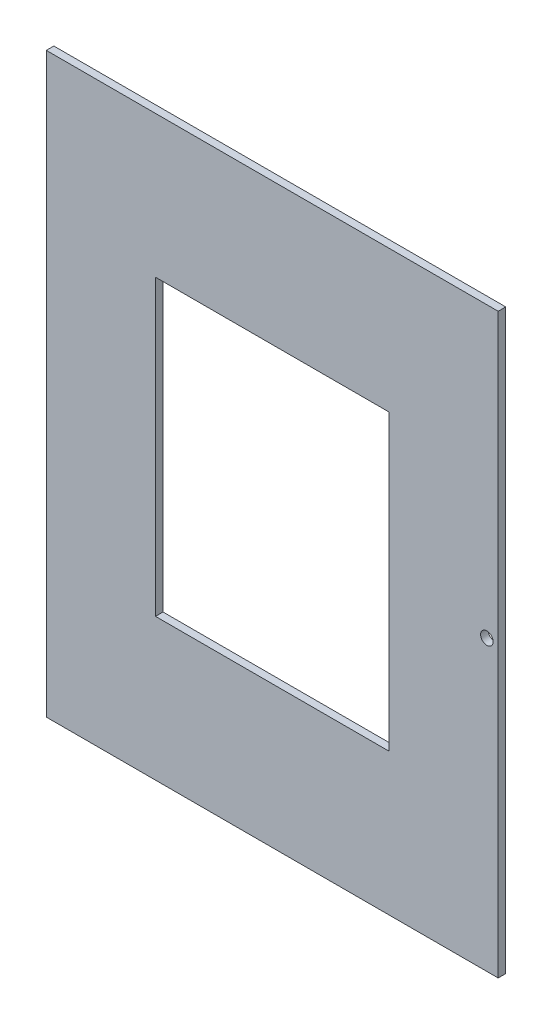
ISO-10303-21;
HEADER;
FILE_DESCRIPTION(('STEP AP214'),'2;1');
FILE_NAME('part.step','',(''),(''),'','','');
FILE_SCHEMA(('AUTOMOTIVE_DESIGN { 1 0 10303 214 1 1 1 1 }'));
ENDSEC;
DATA;
#1=APPLICATION_CONTEXT('core data for automotive mechanical design processes');
#2=APPLICATION_PROTOCOL_DEFINITION('international standard','automotive_design',2000,#1);
#3=PRODUCT_CONTEXT('',#1,'mechanical');
#4=PRODUCT('Part','Part','',(#3));
#5=PRODUCT_RELATED_PRODUCT_CATEGORY('part','',(#4));
#6=PRODUCT_DEFINITION_FORMATION('','',#4);
#7=PRODUCT_DEFINITION_CONTEXT('part definition',#1,'design');
#8=PRODUCT_DEFINITION('design','',#6,#7);
#9=PRODUCT_DEFINITION_SHAPE('','',#8);
#10=(LENGTH_UNIT() NAMED_UNIT(*) SI_UNIT(.MILLI.,.METRE.));
#11=(NAMED_UNIT(*) PLANE_ANGLE_UNIT() SI_UNIT($,.RADIAN.));
#12=(NAMED_UNIT(*) SI_UNIT($,.STERADIAN.) SOLID_ANGLE_UNIT());
#13=UNCERTAINTY_MEASURE_WITH_UNIT(LENGTH_MEASURE(1.E-05),#10,'distance_accuracy_value','');
#14=(GEOMETRIC_REPRESENTATION_CONTEXT(3) GLOBAL_UNCERTAINTY_ASSIGNED_CONTEXT((#13)) GLOBAL_UNIT_ASSIGNED_CONTEXT((#10,
#11,#12)) REPRESENTATION_CONTEXT('',''));
#15=CARTESIAN_POINT('',(0.,0.,0.));
#16=DIRECTION('',(0.,0.,1.));
#17=DIRECTION('',(1.,0.,0.));
#18=AXIS2_PLACEMENT_3D('',#15,#16,#17);
#19=CARTESIAN_POINT('',(0.,-56.5,3.));
#20=DIRECTION('',(0.,1.,0.));
#21=DIRECTION('',(0.,0.,1.));
#22=AXIS2_PLACEMENT_3D('',#19,#20,#21);
#23=PLANE('',#22);
#24=DIRECTION('',(1.,0.,0.));
#25=VECTOR('',#24,1.);
#26=CARTESIAN_POINT('',(0.,-56.5,0.));
#27=LINE('',#26,#25);
#28=CARTESIAN_POINT('',(43.5000000000012,-56.5,0.));
#29=VERTEX_POINT('',#28);
#30=CARTESIAN_POINT('',(136.500000000001,-56.5,0.));
#31=VERTEX_POINT('',#30);
#32=EDGE_CURVE('E161',#29,#31,#27,.T.);
#33=ORIENTED_EDGE('',*,*,#32,.T.);
#34=DIRECTION('',(0.,0.,-1.));
#35=VECTOR('',#34,1.);
#36=CARTESIAN_POINT('',(136.500000000001,-56.5,3.));
#37=LINE('',#36,#35);
#38=CARTESIAN_POINT('',(136.500000000001,-56.5,3.));
#39=VERTEX_POINT('',#38);
#40=EDGE_CURVE('E11',#39,#31,#37,.T.);
#41=ORIENTED_EDGE('',*,*,#40,.F.);
#42=DIRECTION('',(1.,0.,0.));
#43=VECTOR('',#42,1.);
#44=CARTESIAN_POINT('',(0.,-56.5,3.));
#45=LINE('',#44,#43);
#46=CARTESIAN_POINT('',(43.5000000000012,-56.5,3.));
#47=VERTEX_POINT('',#46);
#48=EDGE_CURVE('E120',#47,#39,#45,.T.);
#49=ORIENTED_EDGE('',*,*,#48,.F.);
#50=DIRECTION('',(0.,0.,-1.));
#51=VECTOR('',#50,1.);
#52=CARTESIAN_POINT('',(43.5000000000012,-56.5,3.));
#53=LINE('',#52,#51);
#54=EDGE_CURVE('E59',#47,#29,#53,.T.);
#55=ORIENTED_EDGE('',*,*,#54,.T.);
#56=EDGE_LOOP('',(#33,#41,#49,#55));
#57=FACE_BOUND('',#56,.T.);
#58=ADVANCED_FACE('F39',(#57),#23,.F.);
#59=CARTESIAN_POINT('',(136.500000000001,0.,3.));
#60=DIRECTION('',(1.,0.,0.));
#61=DIRECTION('',(0.,0.,-1.));
#62=AXIS2_PLACEMENT_3D('',#59,#60,#61);
#63=PLANE('',#62);
#64=DIRECTION('',(0.,-1.,0.));
#65=VECTOR('',#64,1.);
#66=CARTESIAN_POINT('',(136.500000000001,0.,0.));
#67=LINE('',#66,#65);
#68=CARTESIAN_POINT('',(136.500000000001,-173.5,0.));
#69=VERTEX_POINT('',#68);
#70=EDGE_CURVE('E127',#31,#69,#67,.T.);
#71=ORIENTED_EDGE('',*,*,#70,.T.);
#72=DIRECTION('',(0.,0.,-1.));
#73=VECTOR('',#72,1.);
#74=CARTESIAN_POINT('',(136.500000000001,-173.5,3.));
#75=LINE('',#74,#73);
#76=CARTESIAN_POINT('',(136.500000000001,-173.5,3.));
#77=VERTEX_POINT('',#76);
#78=EDGE_CURVE('E50',#77,#69,#75,.T.);
#79=ORIENTED_EDGE('',*,*,#78,.F.);
#80=DIRECTION('',(0.,-1.,0.));
#81=VECTOR('',#80,1.);
#82=CARTESIAN_POINT('',(136.500000000001,0.,3.));
#83=LINE('',#82,#81);
#84=EDGE_CURVE('E114',#39,#77,#83,.T.);
#85=ORIENTED_EDGE('',*,*,#84,.F.);
#86=ORIENTED_EDGE('',*,*,#40,.T.);
#87=EDGE_LOOP('',(#71,#79,#85,#86));
#88=FACE_BOUND('',#87,.T.);
#89=ADVANCED_FACE('F126',(#88),#63,.F.);
#90=CARTESIAN_POINT('',(0.,-173.5,3.));
#91=DIRECTION('',(0.,1.,0.));
#92=DIRECTION('',(0.,0.,1.));
#93=AXIS2_PLACEMENT_3D('',#90,#91,#92);
#94=PLANE('',#93);
#95=DIRECTION('',(1.,0.,0.));
#96=VECTOR('',#95,1.);
#97=CARTESIAN_POINT('',(0.,-173.5,0.));
#98=LINE('',#97,#96);
#99=CARTESIAN_POINT('',(43.5000000000012,-173.5,0.));
#100=VERTEX_POINT('',#99);
#101=EDGE_CURVE('E166',#100,#69,#98,.T.);
#102=ORIENTED_EDGE('',*,*,#101,.F.);
#103=DIRECTION('',(0.,0.,-1.));
#104=VECTOR('',#103,1.);
#105=CARTESIAN_POINT('',(43.5000000000012,-173.5,3.));
#106=LINE('',#105,#104);
#107=CARTESIAN_POINT('',(43.5000000000012,-173.5,3.));
#108=VERTEX_POINT('',#107);
#109=EDGE_CURVE('E85',#108,#100,#106,.T.);
#110=ORIENTED_EDGE('',*,*,#109,.F.);
#111=DIRECTION('',(1.,0.,0.));
#112=VECTOR('',#111,1.);
#113=CARTESIAN_POINT('',(0.,-173.5,3.));
#114=LINE('',#113,#112);
#115=EDGE_CURVE('E119',#108,#77,#114,.T.);
#116=ORIENTED_EDGE('',*,*,#115,.T.);
#117=ORIENTED_EDGE('',*,*,#78,.T.);
#118=EDGE_LOOP('',(#102,#110,#116,#117));
#119=FACE_BOUND('',#118,.T.);
#120=ADVANCED_FACE('F132',(#119),#94,.T.);
#121=CARTESIAN_POINT('',(0.,0.,3.));
#122=DIRECTION('',(1.,0.,0.));
#123=DIRECTION('',(0.,1.,0.));
#124=AXIS2_PLACEMENT_3D('',#121,#122,#123);
#125=PLANE('',#124);
#126=DIRECTION('',(0.,-1.,0.));
#127=VECTOR('',#126,1.);
#128=CARTESIAN_POINT('',(0.,0.,0.));
#129=LINE('',#128,#127);
#130=CARTESIAN_POINT('',(0.,0.,0.));
#131=VERTEX_POINT('',#130);
#132=CARTESIAN_POINT('',(0.,-230.,0.));
#133=VERTEX_POINT('',#132);
#134=EDGE_CURVE('E145',#131,#133,#129,.T.);
#135=ORIENTED_EDGE('',*,*,#134,.T.);
#136=DIRECTION('',(0.,0.,-1.));
#137=VECTOR('',#136,1.);
#138=CARTESIAN_POINT('',(0.,-230.,3.));
#139=LINE('',#138,#137);
#140=CARTESIAN_POINT('',(0.,-230.,3.));
#141=VERTEX_POINT('',#140);
#142=EDGE_CURVE('E43',#141,#133,#139,.T.);
#143=ORIENTED_EDGE('',*,*,#142,.F.);
#144=DIRECTION('',(0.,-1.,0.));
#145=VECTOR('',#144,1.);
#146=CARTESIAN_POINT('',(0.,0.,3.));
#147=LINE('',#146,#145);
#148=CARTESIAN_POINT('',(0.,0.,3.));
#149=VERTEX_POINT('',#148);
#150=EDGE_CURVE('E235',#149,#141,#147,.T.);
#151=ORIENTED_EDGE('',*,*,#150,.F.);
#152=DIRECTION('',(0.,0.,-1.));
#153=VECTOR('',#152,1.);
#154=CARTESIAN_POINT('',(0.,0.,3.));
#155=LINE('',#154,#153);
#156=EDGE_CURVE('E137',#149,#131,#155,.T.);
#157=ORIENTED_EDGE('',*,*,#156,.T.);
#158=EDGE_LOOP('',(#135,#143,#151,#157));
#159=FACE_BOUND('',#158,.T.);
#160=ADVANCED_FACE('F193',(#159),#125,.F.);
#161=CARTESIAN_POINT('',(0.,-230.,3.));
#162=DIRECTION('',(0.,1.,0.));
#163=DIRECTION('',(0.,0.,1.));
#164=AXIS2_PLACEMENT_3D('',#161,#162,#163);
#165=PLANE('',#164);
#166=DIRECTION('',(1.,0.,0.));
#167=VECTOR('',#166,1.);
#168=CARTESIAN_POINT('',(0.,-230.,0.));
#169=LINE('',#168,#167);
#170=CARTESIAN_POINT('',(180.000000000002,-230.,0.));
#171=VERTEX_POINT('',#170);
#172=EDGE_CURVE('E149',#133,#171,#169,.T.);
#173=ORIENTED_EDGE('',*,*,#172,.T.);
#174=DIRECTION('',(0.,0.,-1.));
#175=VECTOR('',#174,1.);
#176=CARTESIAN_POINT('',(180.000000000002,-230.,3.));
#177=LINE('',#176,#175);
#178=CARTESIAN_POINT('',(180.000000000002,-230.,3.));
#179=VERTEX_POINT('',#178);
#180=EDGE_CURVE('E182',#179,#171,#177,.T.);
#181=ORIENTED_EDGE('',*,*,#180,.F.);
#182=DIRECTION('',(1.,0.,0.));
#183=VECTOR('',#182,1.);
#184=CARTESIAN_POINT('',(0.,-230.,3.));
#185=LINE('',#184,#183);
#186=EDGE_CURVE('E98',#141,#179,#185,.T.);
#187=ORIENTED_EDGE('',*,*,#186,.F.);
#188=ORIENTED_EDGE('',*,*,#142,.T.);
#189=EDGE_LOOP('',(#173,#181,#187,#188));
#190=FACE_BOUND('',#189,.T.);
#191=ADVANCED_FACE('F189',(#190),#165,.F.);
#192=CARTESIAN_POINT('',(180.,1.88979267017717E-12,3.));
#193=DIRECTION('',(1.,0.,0.));
#194=DIRECTION('',(0.,1.,0.));
#195=AXIS2_PLACEMENT_3D('',#192,#193,#194);
#196=PLANE('',#195);
#197=DIRECTION('',(0.,-1.,0.));
#198=VECTOR('',#197,1.);
#199=CARTESIAN_POINT('',(180.,1.88979267017717E-12,0.));
#200=LINE('',#199,#198);
#201=CARTESIAN_POINT('',(180.,0.,0.));
#202=VERTEX_POINT('',#201);
#203=EDGE_CURVE('E153',#202,#171,#200,.T.);
#204=ORIENTED_EDGE('',*,*,#203,.F.);
#205=DIRECTION('',(0.,0.,-1.));
#206=VECTOR('',#205,1.);
#207=CARTESIAN_POINT('',(180.,0.,3.));
#208=LINE('',#207,#206);
#209=CARTESIAN_POINT('',(180.,0.,3.));
#210=VERTEX_POINT('',#209);
#211=EDGE_CURVE('E180',#210,#202,#208,.T.);
#212=ORIENTED_EDGE('',*,*,#211,.F.);
#213=DIRECTION('',(0.,-1.,0.));
#214=VECTOR('',#213,1.);
#215=CARTESIAN_POINT('',(180.,1.88979267017717E-12,3.));
#216=LINE('',#215,#214);
#217=EDGE_CURVE('E240',#210,#179,#216,.T.);
#218=ORIENTED_EDGE('',*,*,#217,.T.);
#219=ORIENTED_EDGE('',*,*,#180,.T.);
#220=EDGE_LOOP('',(#204,#212,#218,#219));
#221=FACE_BOUND('',#220,.T.);
#222=ADVANCED_FACE('F204',(#221),#196,.T.);
#223=CARTESIAN_POINT('',(0.,0.,3.));
#224=DIRECTION('',(0.,1.,0.));
#225=DIRECTION('',(0.,0.,1.));
#226=AXIS2_PLACEMENT_3D('',#223,#224,#225);
#227=PLANE('',#226);
#228=DIRECTION('',(1.,0.,0.));
#229=VECTOR('',#228,1.);
#230=CARTESIAN_POINT('',(0.,0.,0.));
#231=LINE('',#230,#229);
#232=EDGE_CURVE('E157',#131,#202,#231,.T.);
#233=ORIENTED_EDGE('',*,*,#232,.F.);
#234=ORIENTED_EDGE('',*,*,#156,.F.);
#235=DIRECTION('',(1.,0.,0.));
#236=VECTOR('',#235,1.);
#237=CARTESIAN_POINT('',(0.,0.,3.));
#238=LINE('',#237,#236);
#239=EDGE_CURVE('E202',#149,#210,#238,.T.);
#240=ORIENTED_EDGE('',*,*,#239,.T.);
#241=ORIENTED_EDGE('',*,*,#211,.T.);
#242=EDGE_LOOP('',(#233,#234,#240,#241));
#243=FACE_BOUND('',#242,.T.);
#244=ADVANCED_FACE('F199',(#243),#227,.T.);
#245=CARTESIAN_POINT('',(175.500000000001,-115.,3.));
#246=DIRECTION('',(0.,0.,-1.));
#247=DIRECTION('',(-1.,0.,0.));
#248=AXIS2_PLACEMENT_3D('',#245,#246,#247);
#249=CYLINDRICAL_SURFACE('',#248,2.5);
#250=CARTESIAN_POINT('',(175.500000000001,-115.,3.));
#251=DIRECTION('',(0.,0.,1.));
#252=DIRECTION('',(1.,0.,0.));
#253=AXIS2_PLACEMENT_3D('',#250,#251,#252);
#254=CIRCLE('',#253,2.5);
#255=CARTESIAN_POINT('',(178.000000000001,-115.,3.));
#256=VERTEX_POINT('',#255);
#257=EDGE_CURVE('E173',#256,#256,#254,.T.);
#258=ORIENTED_EDGE('',*,*,#257,.T.);
#259=EDGE_LOOP('',(#258));
#260=FACE_BOUND('',#259,.T.);
#261=CARTESIAN_POINT('',(175.500000000001,-115.,0.));
#262=DIRECTION('',(0.,0.,1.));
#263=DIRECTION('',(1.,0.,0.));
#264=AXIS2_PLACEMENT_3D('',#261,#262,#263);
#265=CIRCLE('',#264,2.5);
#266=CARTESIAN_POINT('',(178.000000000001,-115.,0.));
#267=VERTEX_POINT('',#266);
#268=EDGE_CURVE('E141',#267,#267,#265,.T.);
#269=ORIENTED_EDGE('',*,*,#268,.F.);
#270=EDGE_LOOP('',(#269));
#271=FACE_BOUND('',#270,.T.);
#272=ADVANCED_FACE('F41',(#260,#271),#249,.F.);
#273=CARTESIAN_POINT('',(43.5000000000011,0.,3.));
#274=DIRECTION('',(1.,0.,0.));
#275=DIRECTION('',(0.,1.,0.));
#276=AXIS2_PLACEMENT_3D('',#273,#274,#275);
#277=PLANE('',#276);
#278=DIRECTION('',(0.,-1.,0.));
#279=VECTOR('',#278,1.);
#280=CARTESIAN_POINT('',(43.5000000000011,0.,0.));
#281=LINE('',#280,#279);
#282=EDGE_CURVE('E169',#29,#100,#281,.T.);
#283=ORIENTED_EDGE('',*,*,#282,.F.);
#284=ORIENTED_EDGE('',*,*,#54,.F.);
#285=DIRECTION('',(0.,-1.,0.));
#286=VECTOR('',#285,1.);
#287=CARTESIAN_POINT('',(43.5000000000011,0.,3.));
#288=LINE('',#287,#286);
#289=EDGE_CURVE('E134',#47,#108,#288,.T.);
#290=ORIENTED_EDGE('',*,*,#289,.T.);
#291=ORIENTED_EDGE('',*,*,#109,.T.);
#292=EDGE_LOOP('',(#283,#284,#290,#291));
#293=FACE_BOUND('',#292,.T.);
#294=ADVANCED_FACE('F222',(#293),#277,.T.);
#295=CARTESIAN_POINT('',(0.,0.,3.));
#296=DIRECTION('',(0.,0.,1.));
#297=DIRECTION('',(1.,0.,0.));
#298=AXIS2_PLACEMENT_3D('',#295,#296,#297);
#299=PLANE('',#298);
#300=ORIENTED_EDGE('',*,*,#257,.F.);
#301=EDGE_LOOP('',(#300));
#302=FACE_BOUND('',#301,.T.);
#303=ORIENTED_EDGE('',*,*,#150,.T.);
#304=ORIENTED_EDGE('',*,*,#186,.T.);
#305=ORIENTED_EDGE('',*,*,#217,.F.);
#306=ORIENTED_EDGE('',*,*,#239,.F.);
#307=EDGE_LOOP('',(#303,#304,#305,#306));
#308=FACE_BOUND('',#307,.T.);
#309=ORIENTED_EDGE('',*,*,#48,.T.);
#310=ORIENTED_EDGE('',*,*,#84,.T.);
#311=ORIENTED_EDGE('',*,*,#115,.F.);
#312=ORIENTED_EDGE('',*,*,#289,.F.);
#313=EDGE_LOOP('',(#309,#310,#311,#312));
#314=FACE_BOUND('',#313,.T.);
#315=ADVANCED_FACE('F116',(#302,#308,#314),#299,.T.);
#316=CARTESIAN_POINT('',(0.,0.,0.));
#317=DIRECTION('',(0.,0.,1.));
#318=DIRECTION('',(1.,0.,0.));
#319=AXIS2_PLACEMENT_3D('',#316,#317,#318);
#320=PLANE('',#319);
#321=ORIENTED_EDGE('',*,*,#268,.T.);
#322=EDGE_LOOP('',(#321));
#323=FACE_BOUND('',#322,.T.);
#324=ORIENTED_EDGE('',*,*,#134,.F.);
#325=ORIENTED_EDGE('',*,*,#232,.T.);
#326=ORIENTED_EDGE('',*,*,#203,.T.);
#327=ORIENTED_EDGE('',*,*,#172,.F.);
#328=EDGE_LOOP('',(#324,#325,#326,#327));
#329=FACE_BOUND('',#328,.T.);
#330=ORIENTED_EDGE('',*,*,#32,.F.);
#331=ORIENTED_EDGE('',*,*,#282,.T.);
#332=ORIENTED_EDGE('',*,*,#101,.T.);
#333=ORIENTED_EDGE('',*,*,#70,.F.);
#334=EDGE_LOOP('',(#330,#331,#332,#333));
#335=FACE_BOUND('',#334,.T.);
#336=ADVANCED_FACE('F196',(#323,#329,#335),#320,.F.);
#337=CLOSED_SHELL('',(#58,#89,#120,#160,#191,#222,#244,#272,#294,#315,#336));
#338=MANIFOLD_SOLID_BREP('B2',#337);
#339=ADVANCED_BREP_SHAPE_REPRESENTATION('',(#18,#338),#14);
#340=SHAPE_DEFINITION_REPRESENTATION(#9,#339);
ENDSEC;
END-ISO-10303-21;
